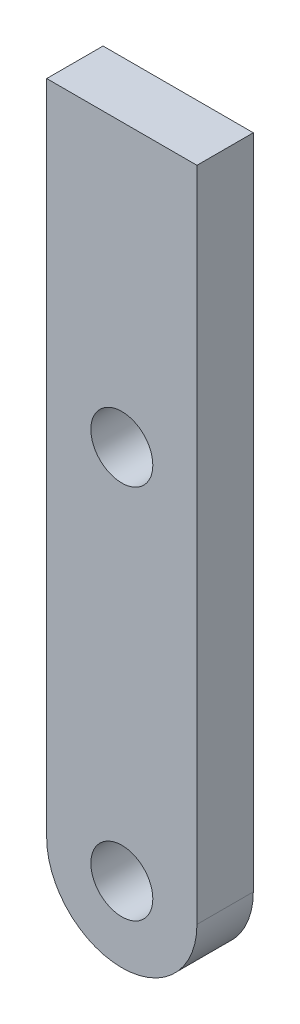
ISO-10303-21;
HEADER;
FILE_DESCRIPTION(('STEP AP214'),'2;1');
FILE_NAME('part.step','',(''),(''),'','','');
FILE_SCHEMA(('AUTOMOTIVE_DESIGN { 1 0 10303 214 1 1 1 1 }'));
ENDSEC;
DATA;
#1=APPLICATION_CONTEXT('core data for automotive mechanical design processes');
#2=APPLICATION_PROTOCOL_DEFINITION('international standard','automotive_design',2000,#1);
#3=PRODUCT_CONTEXT('',#1,'mechanical');
#4=PRODUCT('Part','Part','',(#3));
#5=PRODUCT_RELATED_PRODUCT_CATEGORY('part','',(#4));
#6=PRODUCT_DEFINITION_FORMATION('','',#4);
#7=PRODUCT_DEFINITION_CONTEXT('part definition',#1,'design');
#8=PRODUCT_DEFINITION('design','',#6,#7);
#9=PRODUCT_DEFINITION_SHAPE('','',#8);
#10=(LENGTH_UNIT() NAMED_UNIT(*) SI_UNIT(.MILLI.,.METRE.));
#11=(NAMED_UNIT(*) PLANE_ANGLE_UNIT() SI_UNIT($,.RADIAN.));
#12=(NAMED_UNIT(*) SI_UNIT($,.STERADIAN.) SOLID_ANGLE_UNIT());
#13=UNCERTAINTY_MEASURE_WITH_UNIT(LENGTH_MEASURE(1.E-05),#10,'distance_accuracy_value','');
#14=(GEOMETRIC_REPRESENTATION_CONTEXT(3) GLOBAL_UNCERTAINTY_ASSIGNED_CONTEXT((#13)) GLOBAL_UNIT_ASSIGNED_CONTEXT((#10,
#11,#12)) REPRESENTATION_CONTEXT('',''));
#15=CARTESIAN_POINT('',(0.,0.,0.));
#16=DIRECTION('',(0.,0.,1.));
#17=DIRECTION('',(1.,0.,0.));
#18=AXIS2_PLACEMENT_3D('',#15,#16,#17);
#19=CARTESIAN_POINT('',(0.,10.,3.));
#20=DIRECTION('',(0.,0.,1.));
#21=DIRECTION('',(1.,0.,0.));
#22=AXIS2_PLACEMENT_3D('',#19,#20,#21);
#23=PLANE('',#22);
#24=CARTESIAN_POINT('',(0.,10.,3.));
#25=DIRECTION('',(0.,0.,1.));
#26=DIRECTION('',(1.,0.,0.));
#27=AXIS2_PLACEMENT_3D('',#24,#25,#26);
#28=CIRCLE('',#27,1.65);
#29=CARTESIAN_POINT('',(1.65,10.,3.));
#30=VERTEX_POINT('',#29);
#31=EDGE_CURVE('E107',#30,#30,#28,.T.);
#32=ORIENTED_EDGE('',*,*,#31,.F.);
#33=EDGE_LOOP('',(#32));
#34=FACE_BOUND('',#33,.T.);
#35=DIRECTION('',(0.,1.,0.));
#36=VECTOR('',#35,1.);
#37=CARTESIAN_POINT('',(3.99999999999999,10.,3.));
#38=LINE('',#37,#36);
#39=CARTESIAN_POINT('',(4.,-10.,3.));
#40=VERTEX_POINT('',#39);
#41=CARTESIAN_POINT('',(4.,25.,3.));
#42=VERTEX_POINT('',#41);
#43=EDGE_CURVE('E95',#40,#42,#38,.T.);
#44=ORIENTED_EDGE('',*,*,#43,.T.);
#45=DIRECTION('',(-1.,0.,0.));
#46=VECTOR('',#45,1.);
#47=CARTESIAN_POINT('',(-4.,25.,3.));
#48=LINE('',#47,#46);
#49=CARTESIAN_POINT('',(-4.,25.,3.));
#50=VERTEX_POINT('',#49);
#51=EDGE_CURVE('E89',#42,#50,#48,.T.);
#52=ORIENTED_EDGE('',*,*,#51,.T.);
#53=DIRECTION('',(0.,-1.,0.));
#54=VECTOR('',#53,1.);
#55=CARTESIAN_POINT('',(-4.,10.,3.));
#56=LINE('',#55,#54);
#57=CARTESIAN_POINT('',(-3.99999999999999,-10.,3.));
#58=VERTEX_POINT('',#57);
#59=EDGE_CURVE('E79',#50,#58,#56,.T.);
#60=ORIENTED_EDGE('',*,*,#59,.T.);
#61=CARTESIAN_POINT('',(0.,-10.,3.));
#62=DIRECTION('',(0.,0.,1.));
#63=DIRECTION('',(1.,0.,0.));
#64=AXIS2_PLACEMENT_3D('',#61,#62,#63);
#65=CIRCLE('',#64,4.);
#66=EDGE_CURVE('E52',#58,#40,#65,.T.);
#67=ORIENTED_EDGE('',*,*,#66,.T.);
#68=EDGE_LOOP('',(#44,#52,#60,#67));
#69=FACE_BOUND('',#68,.T.);
#70=CARTESIAN_POINT('',(0.,-10.,3.));
#71=DIRECTION('',(0.,0.,1.));
#72=DIRECTION('',(1.,0.,0.));
#73=AXIS2_PLACEMENT_3D('',#70,#71,#72);
#74=CIRCLE('',#73,1.65);
#75=CARTESIAN_POINT('',(1.65,-10.,3.));
#76=VERTEX_POINT('',#75);
#77=EDGE_CURVE('E100',#76,#76,#74,.T.);
#78=ORIENTED_EDGE('',*,*,#77,.F.);
#79=EDGE_LOOP('',(#78));
#80=FACE_BOUND('',#79,.T.);
#81=ADVANCED_FACE('F35',(#34,#69,#80),#23,.T.);
#82=CARTESIAN_POINT('',(0.,10.,0.));
#83=DIRECTION('',(0.,0.,1.));
#84=DIRECTION('',(1.,0.,0.));
#85=AXIS2_PLACEMENT_3D('',#82,#83,#84);
#86=PLANE('',#85);
#87=DIRECTION('',(0.,-1.,0.));
#88=VECTOR('',#87,1.);
#89=CARTESIAN_POINT('',(-4.,10.,0.));
#90=LINE('',#89,#88);
#91=CARTESIAN_POINT('',(-4.,25.,0.));
#92=VERTEX_POINT('',#91);
#93=CARTESIAN_POINT('',(-3.99999999999999,-10.,0.));
#94=VERTEX_POINT('',#93);
#95=EDGE_CURVE('E63',#92,#94,#90,.T.);
#96=ORIENTED_EDGE('',*,*,#95,.F.);
#97=DIRECTION('',(1.,0.,0.));
#98=VECTOR('',#97,1.);
#99=CARTESIAN_POINT('',(-4.,25.,0.));
#100=LINE('',#99,#98);
#101=CARTESIAN_POINT('',(4.,25.,0.));
#102=VERTEX_POINT('',#101);
#103=EDGE_CURVE('E90',#92,#102,#100,.T.);
#104=ORIENTED_EDGE('',*,*,#103,.T.);
#105=DIRECTION('',(0.,1.,0.));
#106=VECTOR('',#105,1.);
#107=CARTESIAN_POINT('',(3.99999999999999,10.,0.));
#108=LINE('',#107,#106);
#109=CARTESIAN_POINT('',(4.,-10.,0.));
#110=VERTEX_POINT('',#109);
#111=EDGE_CURVE('E71',#110,#102,#108,.T.);
#112=ORIENTED_EDGE('',*,*,#111,.F.);
#113=CARTESIAN_POINT('',(0.,-10.,0.));
#114=DIRECTION('',(0.,0.,1.));
#115=DIRECTION('',(1.,0.,0.));
#116=AXIS2_PLACEMENT_3D('',#113,#114,#115);
#117=CIRCLE('',#116,4.);
#118=EDGE_CURVE('E115',#94,#110,#117,.T.);
#119=ORIENTED_EDGE('',*,*,#118,.F.);
#120=EDGE_LOOP('',(#96,#104,#112,#119));
#121=FACE_BOUND('',#120,.T.);
#122=CARTESIAN_POINT('',(0.,10.,0.));
#123=DIRECTION('',(0.,0.,1.));
#124=DIRECTION('',(1.,0.,0.));
#125=AXIS2_PLACEMENT_3D('',#122,#123,#124);
#126=CIRCLE('',#125,1.65);
#127=CARTESIAN_POINT('',(1.65,10.,0.));
#128=VERTEX_POINT('',#127);
#129=EDGE_CURVE('E103',#128,#128,#126,.T.);
#130=ORIENTED_EDGE('',*,*,#129,.T.);
#131=EDGE_LOOP('',(#130));
#132=FACE_BOUND('',#131,.T.);
#133=CARTESIAN_POINT('',(0.,-10.,0.));
#134=DIRECTION('',(0.,0.,1.));
#135=DIRECTION('',(1.,0.,0.));
#136=AXIS2_PLACEMENT_3D('',#133,#134,#135);
#137=CIRCLE('',#136,1.65);
#138=CARTESIAN_POINT('',(1.65,-10.,0.));
#139=VERTEX_POINT('',#138);
#140=EDGE_CURVE('E104',#139,#139,#137,.T.);
#141=ORIENTED_EDGE('',*,*,#140,.T.);
#142=EDGE_LOOP('',(#141));
#143=FACE_BOUND('',#142,.T.);
#144=ADVANCED_FACE('F121',(#121,#132,#143),#86,.F.);
#145=CARTESIAN_POINT('',(-4.,10.,3.));
#146=DIRECTION('',(1.,0.,0.));
#147=DIRECTION('',(0.,1.,0.));
#148=AXIS2_PLACEMENT_3D('',#145,#146,#147);
#149=PLANE('',#148);
#150=ORIENTED_EDGE('',*,*,#95,.T.);
#151=DIRECTION('',(0.,0.,-1.));
#152=VECTOR('',#151,1.);
#153=CARTESIAN_POINT('',(-3.99999999999999,-10.,3.));
#154=LINE('',#153,#152);
#155=EDGE_CURVE('E11',#58,#94,#154,.T.);
#156=ORIENTED_EDGE('',*,*,#155,.F.);
#157=ORIENTED_EDGE('',*,*,#59,.F.);
#158=DIRECTION('',(0.,0.,1.));
#159=VECTOR('',#158,1.);
#160=CARTESIAN_POINT('',(-4.,25.,-17.));
#161=LINE('',#160,#159);
#162=EDGE_CURVE('E81',#92,#50,#161,.T.);
#163=ORIENTED_EDGE('',*,*,#162,.F.);
#164=EDGE_LOOP('',(#150,#156,#157,#163));
#165=FACE_BOUND('',#164,.T.);
#166=ADVANCED_FACE('F37',(#165),#149,.F.);
#167=CARTESIAN_POINT('',(0.,-10.,3.));
#168=DIRECTION('',(0.,0.,-1.));
#169=DIRECTION('',(-1.,0.,0.));
#170=AXIS2_PLACEMENT_3D('',#167,#168,#169);
#171=CYLINDRICAL_SURFACE('',#170,4.);
#172=ORIENTED_EDGE('',*,*,#118,.T.);
#173=DIRECTION('',(0.,0.,-1.));
#174=VECTOR('',#173,1.);
#175=CARTESIAN_POINT('',(4.,-10.,3.));
#176=LINE('',#175,#174);
#177=EDGE_CURVE('E44',#40,#110,#176,.T.);
#178=ORIENTED_EDGE('',*,*,#177,.F.);
#179=ORIENTED_EDGE('',*,*,#66,.F.);
#180=ORIENTED_EDGE('',*,*,#155,.T.);
#181=EDGE_LOOP('',(#172,#178,#179,#180));
#182=FACE_BOUND('',#181,.T.);
#183=ADVANCED_FACE('F123',(#182),#171,.T.);
#184=CARTESIAN_POINT('',(3.99999999999999,10.,3.));
#185=DIRECTION('',(-1.,0.,0.));
#186=DIRECTION('',(0.,-1.,0.));
#187=AXIS2_PLACEMENT_3D('',#184,#185,#186);
#188=PLANE('',#187);
#189=ORIENTED_EDGE('',*,*,#111,.T.);
#190=DIRECTION('',(0.,0.,1.));
#191=VECTOR('',#190,1.);
#192=CARTESIAN_POINT('',(4.,25.,-17.));
#193=LINE('',#192,#191);
#194=EDGE_CURVE('E91',#102,#42,#193,.T.);
#195=ORIENTED_EDGE('',*,*,#194,.T.);
#196=ORIENTED_EDGE('',*,*,#43,.F.);
#197=ORIENTED_EDGE('',*,*,#177,.T.);
#198=EDGE_LOOP('',(#189,#195,#196,#197));
#199=FACE_BOUND('',#198,.T.);
#200=ADVANCED_FACE('F117',(#199),#188,.F.);
#201=CARTESIAN_POINT('',(0.,10.,3.));
#202=DIRECTION('',(0.,0.,-1.));
#203=DIRECTION('',(-1.,0.,0.));
#204=AXIS2_PLACEMENT_3D('',#201,#202,#203);
#205=CYLINDRICAL_SURFACE('',#204,1.65);
#206=ORIENTED_EDGE('',*,*,#31,.T.);
#207=EDGE_LOOP('',(#206));
#208=FACE_BOUND('',#207,.T.);
#209=ORIENTED_EDGE('',*,*,#129,.F.);
#210=EDGE_LOOP('',(#209));
#211=FACE_BOUND('',#210,.T.);
#212=ADVANCED_FACE('F129',(#208,#211),#205,.F.);
#213=CARTESIAN_POINT('',(0.,-10.,3.));
#214=DIRECTION('',(0.,0.,-1.));
#215=DIRECTION('',(-1.,0.,0.));
#216=AXIS2_PLACEMENT_3D('',#213,#214,#215);
#217=CYLINDRICAL_SURFACE('',#216,1.65);
#218=ORIENTED_EDGE('',*,*,#77,.T.);
#219=EDGE_LOOP('',(#218));
#220=FACE_BOUND('',#219,.T.);
#221=ORIENTED_EDGE('',*,*,#140,.F.);
#222=EDGE_LOOP('',(#221));
#223=FACE_BOUND('',#222,.T.);
#224=ADVANCED_FACE('F142',(#220,#223),#217,.F.);
#225=CARTESIAN_POINT('',(-4.,25.,-17.));
#226=DIRECTION('',(0.,1.,0.));
#227=DIRECTION('',(0.,0.,1.));
#228=AXIS2_PLACEMENT_3D('',#225,#226,#227);
#229=PLANE('',#228);
#230=ORIENTED_EDGE('',*,*,#103,.F.);
#231=ORIENTED_EDGE('',*,*,#162,.T.);
#232=ORIENTED_EDGE('',*,*,#51,.F.);
#233=ORIENTED_EDGE('',*,*,#194,.F.);
#234=EDGE_LOOP('',(#230,#231,#232,#233));
#235=FACE_BOUND('',#234,.T.);
#236=ADVANCED_FACE('F87',(#235),#229,.T.);
#237=CLOSED_SHELL('',(#81,#144,#166,#183,#200,#212,#224,#236));
#238=MANIFOLD_SOLID_BREP('B2',#237);
#239=ADVANCED_BREP_SHAPE_REPRESENTATION('',(#18,#238),#14);
#240=SHAPE_DEFINITION_REPRESENTATION(#9,#239);
ENDSEC;
END-ISO-10303-21;
